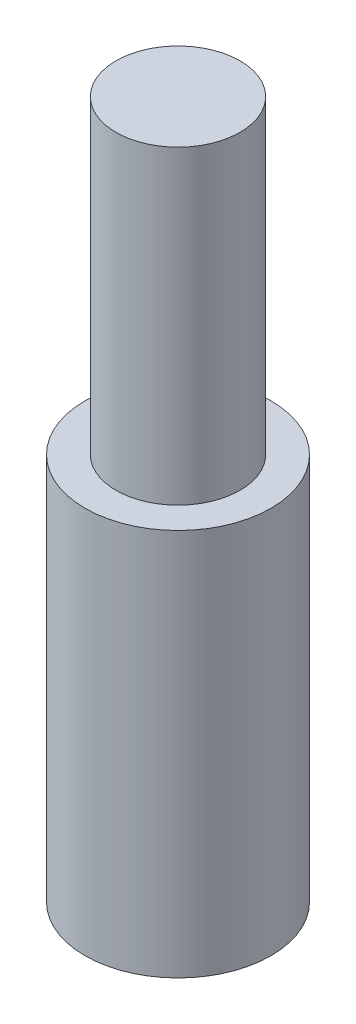
ISO-10303-21;
HEADER;
FILE_DESCRIPTION(('STEP AP214'),'2;1');
FILE_NAME('part.step','',(''),(''),'','','');
FILE_SCHEMA(('AUTOMOTIVE_DESIGN { 1 0 10303 214 1 1 1 1 }'));
ENDSEC;
DATA;
#1=APPLICATION_CONTEXT('core data for automotive mechanical design processes');
#2=APPLICATION_PROTOCOL_DEFINITION('international standard','automotive_design',2000,#1);
#3=PRODUCT_CONTEXT('',#1,'mechanical');
#4=PRODUCT('Part','Part','',(#3));
#5=PRODUCT_RELATED_PRODUCT_CATEGORY('part','',(#4));
#6=PRODUCT_DEFINITION_FORMATION('','',#4);
#7=PRODUCT_DEFINITION_CONTEXT('part definition',#1,'design');
#8=PRODUCT_DEFINITION('design','',#6,#7);
#9=PRODUCT_DEFINITION_SHAPE('','',#8);
#10=(LENGTH_UNIT() NAMED_UNIT(*) SI_UNIT(.MILLI.,.METRE.));
#11=(NAMED_UNIT(*) PLANE_ANGLE_UNIT() SI_UNIT($,.RADIAN.));
#12=(NAMED_UNIT(*) SI_UNIT($,.STERADIAN.) SOLID_ANGLE_UNIT());
#13=UNCERTAINTY_MEASURE_WITH_UNIT(LENGTH_MEASURE(1.E-05),#10,'distance_accuracy_value','');
#14=(GEOMETRIC_REPRESENTATION_CONTEXT(3) GLOBAL_UNCERTAINTY_ASSIGNED_CONTEXT((#13)) GLOBAL_UNIT_ASSIGNED_CONTEXT((#10,
#11,#12)) REPRESENTATION_CONTEXT('',''));
#15=CARTESIAN_POINT('',(0.,0.,0.));
#16=DIRECTION('',(0.,0.,1.));
#17=DIRECTION('',(1.,0.,0.));
#18=AXIS2_PLACEMENT_3D('',#15,#16,#17);
#19=CARTESIAN_POINT('',(6.00000000000001,0.,0.));
#20=DIRECTION('',(0.,-1.,0.));
#21=DIRECTION('',(0.,0.,-1.));
#22=AXIS2_PLACEMENT_3D('',#19,#20,#21);
#23=PLANE('',#22);
#24=CARTESIAN_POINT('',(0.,0.,0.));
#25=DIRECTION('',(0.,-1.,0.));
#26=DIRECTION('',(0.,0.,-1.));
#27=AXIS2_PLACEMENT_3D('',#24,#25,#26);
#28=CIRCLE('',#27,6.00000000000001);
#29=CARTESIAN_POINT('',(0.,0.,-6.00000000000001));
#30=VERTEX_POINT('',#29);
#31=EDGE_CURVE('E10',#30,#30,#28,.T.);
#32=ORIENTED_EDGE('',*,*,#31,.T.);
#33=EDGE_LOOP('',(#32));
#34=FACE_BOUND('',#33,.T.);
#35=ADVANCED_FACE('F30',(#34),#23,.T.);
#36=CARTESIAN_POINT('',(0.,-3.34601620455269,0.));
#37=DIRECTION('',(0.,-1.,0.));
#38=DIRECTION('',(0.,0.,-1.));
#39=AXIS2_PLACEMENT_3D('',#36,#37,#38);
#40=CYLINDRICAL_SURFACE('',#39,6.00000000000001);
#41=CARTESIAN_POINT('',(0.,25.,0.));
#42=DIRECTION('',(0.,-1.,0.));
#43=DIRECTION('',(0.,0.,-1.));
#44=AXIS2_PLACEMENT_3D('',#41,#42,#43);
#45=CIRCLE('',#44,6.);
#46=CARTESIAN_POINT('',(0.,25.,-6.));
#47=VERTEX_POINT('',#46);
#48=EDGE_CURVE('E36',#47,#47,#45,.T.);
#49=ORIENTED_EDGE('',*,*,#48,.T.);
#50=EDGE_LOOP('',(#49));
#51=FACE_BOUND('',#50,.T.);
#52=ORIENTED_EDGE('',*,*,#31,.F.);
#53=EDGE_LOOP('',(#52));
#54=FACE_BOUND('',#53,.T.);
#55=ADVANCED_FACE('F62',(#51,#54),#40,.T.);
#56=CARTESIAN_POINT('',(4.,25.,0.));
#57=DIRECTION('',(0.,1.,0.));
#58=DIRECTION('',(0.,0.,1.));
#59=AXIS2_PLACEMENT_3D('',#56,#57,#58);
#60=PLANE('',#59);
#61=CARTESIAN_POINT('',(0.,25.,0.));
#62=DIRECTION('',(0.,-1.,0.));
#63=DIRECTION('',(0.,0.,-1.));
#64=AXIS2_PLACEMENT_3D('',#61,#62,#63);
#65=CIRCLE('',#64,4.);
#66=CARTESIAN_POINT('',(0.,25.,-4.));
#67=VERTEX_POINT('',#66);
#68=EDGE_CURVE('E40',#67,#67,#65,.T.);
#69=ORIENTED_EDGE('',*,*,#68,.T.);
#70=EDGE_LOOP('',(#69));
#71=FACE_BOUND('',#70,.T.);
#72=ORIENTED_EDGE('',*,*,#48,.F.);
#73=EDGE_LOOP('',(#72));
#74=FACE_BOUND('',#73,.T.);
#75=ADVANCED_FACE('F59',(#71,#74),#60,.T.);
#76=CARTESIAN_POINT('',(0.,-3.34601620455269,0.));
#77=DIRECTION('',(0.,-1.,0.));
#78=DIRECTION('',(0.,0.,-1.));
#79=AXIS2_PLACEMENT_3D('',#76,#77,#78);
#80=CYLINDRICAL_SURFACE('',#79,4.);
#81=CARTESIAN_POINT('',(0.,45.,0.));
#82=DIRECTION('',(0.,-1.,0.));
#83=DIRECTION('',(0.,0.,-1.));
#84=AXIS2_PLACEMENT_3D('',#81,#82,#83);
#85=CIRCLE('',#84,4.);
#86=CARTESIAN_POINT('',(0.,45.,-4.));
#87=VERTEX_POINT('',#86);
#88=EDGE_CURVE('E44',#87,#87,#85,.T.);
#89=ORIENTED_EDGE('',*,*,#88,.T.);
#90=EDGE_LOOP('',(#89));
#91=FACE_BOUND('',#90,.T.);
#92=ORIENTED_EDGE('',*,*,#68,.F.);
#93=EDGE_LOOP('',(#92));
#94=FACE_BOUND('',#93,.T.);
#95=ADVANCED_FACE('F50',(#91,#94),#80,.T.);
#96=CARTESIAN_POINT('',(0.,45.,0.));
#97=DIRECTION('',(0.,1.,0.));
#98=DIRECTION('',(0.,0.,1.));
#99=AXIS2_PLACEMENT_3D('',#96,#97,#98);
#100=PLANE('',#99);
#101=ORIENTED_EDGE('',*,*,#88,.F.);
#102=EDGE_LOOP('',(#101));
#103=FACE_BOUND('',#102,.T.);
#104=ADVANCED_FACE('F53',(#103),#100,.T.);
#105=CLOSED_SHELL('',(#35,#55,#75,#95,#104));
#106=MANIFOLD_SOLID_BREP('B2',#105);
#107=ADVANCED_BREP_SHAPE_REPRESENTATION('',(#18,#106),#14);
#108=SHAPE_DEFINITION_REPRESENTATION(#9,#107);
ENDSEC;
END-ISO-10303-21;
